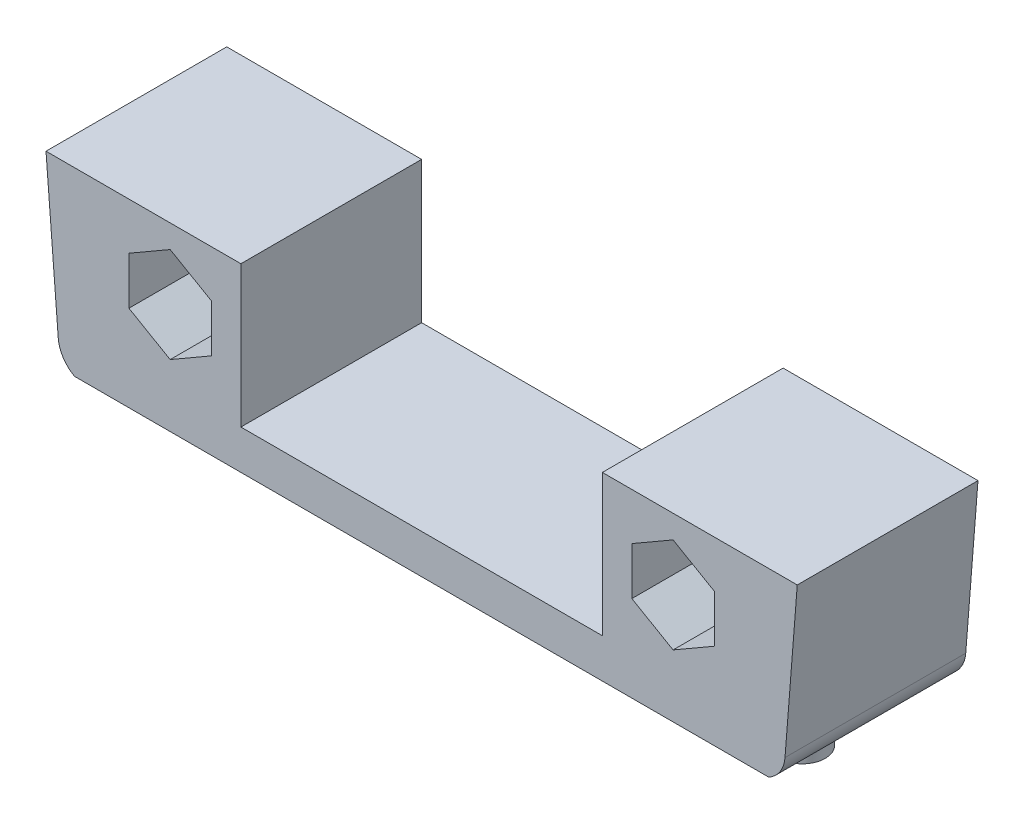
ISO-10303-21;
HEADER;
FILE_DESCRIPTION(('STEP AP214'),'2;1');
FILE_NAME('part.step','',(''),(''),'','','');
FILE_SCHEMA(('AUTOMOTIVE_DESIGN { 1 0 10303 214 1 1 1 1 }'));
ENDSEC;
DATA;
#1=APPLICATION_CONTEXT('core data for automotive mechanical design processes');
#2=APPLICATION_PROTOCOL_DEFINITION('international standard','automotive_design',2000,#1);
#3=PRODUCT_CONTEXT('',#1,'mechanical');
#4=PRODUCT('Part','Part','',(#3));
#5=PRODUCT_RELATED_PRODUCT_CATEGORY('part','',(#4));
#6=PRODUCT_DEFINITION_FORMATION('','',#4);
#7=PRODUCT_DEFINITION_CONTEXT('part definition',#1,'design');
#8=PRODUCT_DEFINITION('design','',#6,#7);
#9=PRODUCT_DEFINITION_SHAPE('','',#8);
#10=(LENGTH_UNIT() NAMED_UNIT(*) SI_UNIT(.MILLI.,.METRE.));
#11=(NAMED_UNIT(*) PLANE_ANGLE_UNIT() SI_UNIT($,.RADIAN.));
#12=(NAMED_UNIT(*) SI_UNIT($,.STERADIAN.) SOLID_ANGLE_UNIT());
#13=UNCERTAINTY_MEASURE_WITH_UNIT(LENGTH_MEASURE(1.E-05),#10,'distance_accuracy_value','');
#14=(GEOMETRIC_REPRESENTATION_CONTEXT(3) GLOBAL_UNCERTAINTY_ASSIGNED_CONTEXT((#13)) GLOBAL_UNIT_ASSIGNED_CONTEXT((#10,
#11,#12)) REPRESENTATION_CONTEXT('',''));
#15=CARTESIAN_POINT('',(0.,0.,0.));
#16=DIRECTION('',(0.,0.,1.));
#17=DIRECTION('',(1.,0.,0.));
#18=AXIS2_PLACEMENT_3D('',#15,#16,#17);
#19=CARTESIAN_POINT('',(15.7329265929826,-89.2258605561515,11.5));
#20=DIRECTION('',(-0.173648177666951,0.984807753012204,0.));
#21=DIRECTION('',(-0.984807753012205,-0.173648177666951,0.));
#22=AXIS2_PLACEMENT_3D('',#19,#20,#21);
#23=PLANE('',#22);
#24=DIRECTION('',(0.,0.,-1.));
#25=VECTOR('',#24,1.);
#26=CARTESIAN_POINT('',(7.28456272965367,-90.715535048099,2.25));
#27=LINE('',#26,#25);
#28=CARTESIAN_POINT('',(7.28456272965367,-90.715535048099,2.25));
#29=VERTEX_POINT('',#28);
#30=CARTESIAN_POINT('',(7.28456272965367,-90.715535048099,0.));
#31=VERTEX_POINT('',#30);
#32=EDGE_CURVE('E523',#29,#31,#27,.T.);
#33=ORIENTED_EDGE('',*,*,#32,.T.);
#34=DIRECTION('',(0.984807753012204,0.173648177666951,0.));
#35=VECTOR('',#34,1.);
#36=CARTESIAN_POINT('',(15.7329265929826,-89.2258605561515,0.));
#37=LINE('',#36,#35);
#38=CARTESIAN_POINT('',(21.474960733196,-88.2133850130826,0.));
#39=VERTEX_POINT('',#38);
#40=EDGE_CURVE('E251',#31,#39,#37,.T.);
#41=ORIENTED_EDGE('',*,*,#40,.T.);
#42=DIRECTION('',(0.,0.,-1.));
#43=VECTOR('',#42,1.);
#44=CARTESIAN_POINT('',(21.474960733196,-88.2133850130826,11.5));
#45=LINE('',#44,#43);
#46=CARTESIAN_POINT('',(21.474960733196,-88.2133850130826,2.25));
#47=VERTEX_POINT('',#46);
#48=EDGE_CURVE('E332',#47,#39,#45,.T.);
#49=ORIENTED_EDGE('',*,*,#48,.F.);
#50=DIRECTION('',(0.984807753012205,0.173648177666951,0.));
#51=VECTOR('',#50,1.);
#52=CARTESIAN_POINT('',(15.7329265929826,-89.2258605561515,2.25));
#53=LINE('',#52,#51);
#54=EDGE_CURVE('E399',#29,#47,#53,.T.);
#55=ORIENTED_EDGE('',*,*,#54,.F.);
#56=EDGE_LOOP('',(#33,#41,#49,#55));
#57=FACE_BOUND('',#56,.T.);
#58=ADVANCED_FACE('F34',(#57),#23,.F.);
#59=DIRECTION('',(0.,0.,1.));
#60=VECTOR('',#59,1.);
#61=CARTESIAN_POINT('',(4.28456272965367,-91.2445159902244,2.25));
#62=LINE('',#61,#60);
#63=CARTESIAN_POINT('',(4.28456272965367,-91.2445159902244,0.));
#64=VERTEX_POINT('',#63);
#65=CARTESIAN_POINT('',(4.28456272965367,-91.2445159902244,2.25));
#66=VERTEX_POINT('',#65);
#67=EDGE_CURVE('E241',#64,#66,#62,.T.);
#68=ORIENTED_EDGE('',*,*,#67,.T.);
#69=CARTESIAN_POINT('',(2.28636554133743E-12,-92.,2.25));
#70=VERTEX_POINT('',#69);
#71=EDGE_CURVE('E376',#70,#66,#53,.T.);
#72=ORIENTED_EDGE('',*,*,#71,.F.);
#73=DIRECTION('',(0.,0.,-1.));
#74=VECTOR('',#73,1.);
#75=CARTESIAN_POINT('',(2.26207941267376E-12,-92.,11.5));
#76=LINE('',#75,#74);
#77=CARTESIAN_POINT('',(2.26207941267376E-12,-92.,0.));
#78=VERTEX_POINT('',#77);
#79=EDGE_CURVE('E341',#70,#78,#76,.T.);
#80=ORIENTED_EDGE('',*,*,#79,.T.);
#81=EDGE_CURVE('E456',#78,#64,#37,.T.);
#82=ORIENTED_EDGE('',*,*,#81,.T.);
#83=EDGE_LOOP('',(#68,#72,#80,#82));
#84=FACE_BOUND('',#83,.T.);
#85=ADVANCED_FACE('F491',(#84),#23,.F.);
#86=CARTESIAN_POINT('',(0.,-85.5,11.5));
#87=DIRECTION('',(0.,-1.,0.));
#88=DIRECTION('',(0.,0.,-1.));
#89=AXIS2_PLACEMENT_3D('',#86,#87,#88);
#90=PLANE('',#89);
#91=DIRECTION('',(0.,0.,1.));
#92=VECTOR('',#91,1.);
#93=CARTESIAN_POINT('',(7.28456272965367,-85.5,2.25));
#94=LINE('',#93,#92);
#95=CARTESIAN_POINT('',(7.28456272965367,-85.5,0.));
#96=VERTEX_POINT('',#95);
#97=CARTESIAN_POINT('',(7.28456272965367,-85.5,2.25));
#98=VERTEX_POINT('',#97);
#99=EDGE_CURVE('E231',#96,#98,#94,.T.);
#100=ORIENTED_EDGE('',*,*,#99,.T.);
#101=DIRECTION('',(-1.,0.,0.));
#102=VECTOR('',#101,1.);
#103=CARTESIAN_POINT('',(7.28456272965367,-85.5,2.25));
#104=LINE('',#103,#102);
#105=CARTESIAN_POINT('',(4.28456272965367,-85.5,2.25));
#106=VERTEX_POINT('',#105);
#107=EDGE_CURVE('E252',#98,#106,#104,.T.);
#108=ORIENTED_EDGE('',*,*,#107,.T.);
#109=DIRECTION('',(0.,0.,-1.));
#110=VECTOR('',#109,1.);
#111=CARTESIAN_POINT('',(4.28456272965367,-85.5,2.25));
#112=LINE('',#111,#110);
#113=CARTESIAN_POINT('',(4.28456272965367,-85.5,0.));
#114=VERTEX_POINT('',#113);
#115=EDGE_CURVE('E242',#106,#114,#112,.T.);
#116=ORIENTED_EDGE('',*,*,#115,.T.);
#117=DIRECTION('',(-1.,0.,0.));
#118=VECTOR('',#117,1.);
#119=CARTESIAN_POINT('',(0.,-85.5,0.));
#120=LINE('',#119,#118);
#121=CARTESIAN_POINT('',(-11.5,-85.5,0.));
#122=VERTEX_POINT('',#121);
#123=EDGE_CURVE('E261',#114,#122,#120,.T.);
#124=ORIENTED_EDGE('',*,*,#123,.T.);
#125=DIRECTION('',(0.,0.,-1.));
#126=VECTOR('',#125,1.);
#127=CARTESIAN_POINT('',(-11.5,-85.5,11.5));
#128=LINE('',#127,#126);
#129=CARTESIAN_POINT('',(-11.5,-85.5,11.5));
#130=VERTEX_POINT('',#129);
#131=EDGE_CURVE('E353',#130,#122,#128,.T.);
#132=ORIENTED_EDGE('',*,*,#131,.F.);
#133=DIRECTION('',(-1.,0.,0.));
#134=VECTOR('',#133,1.);
#135=CARTESIAN_POINT('',(0.,-85.5,11.5));
#136=LINE('',#135,#134);
#137=CARTESIAN_POINT('',(11.5,-85.5,11.5));
#138=VERTEX_POINT('',#137);
#139=EDGE_CURVE('E412',#138,#130,#136,.T.);
#140=ORIENTED_EDGE('',*,*,#139,.F.);
#141=DIRECTION('',(0.,0.,-1.));
#142=VECTOR('',#141,1.);
#143=CARTESIAN_POINT('',(11.5,-85.5,11.5));
#144=LINE('',#143,#142);
#145=CARTESIAN_POINT('',(11.5,-85.5,0.));
#146=VERTEX_POINT('',#145);
#147=EDGE_CURVE('E259',#138,#146,#144,.T.);
#148=ORIENTED_EDGE('',*,*,#147,.T.);
#149=EDGE_CURVE('E249',#146,#96,#120,.T.);
#150=ORIENTED_EDGE('',*,*,#149,.T.);
#151=EDGE_LOOP('',(#100,#108,#116,#124,#132,#140,#148,#150));
#152=FACE_BOUND('',#151,.T.);
#153=ADVANCED_FACE('F256',(#152),#90,.F.);
#154=CARTESIAN_POINT('',(0.,0.,0.));
#155=DIRECTION('',(0.,0.,1.));
#156=DIRECTION('',(1.,0.,0.));
#157=AXIS2_PLACEMENT_3D('',#154,#155,#156);
#158=PLANE('',#157);
#159=DIRECTION('',(0.866025403784439,-0.5,0.));
#160=VECTOR('',#159,1.);
#161=CARTESIAN_POINT('',(-32.3865288532697,-56.0951134546586,0.));
#162=LINE('',#161,#160);
#163=CARTESIAN_POINT('',(13.3750000000001,-82.5155444566228,0.));
#164=VERTEX_POINT('',#163);
#165=CARTESIAN_POINT('',(16.,-84.0310889132455,0.));
#166=VERTEX_POINT('',#165);
#167=EDGE_CURVE('E296',#164,#166,#162,.T.);
#168=ORIENTED_EDGE('',*,*,#167,.T.);
#169=DIRECTION('',(0.86602540378444,0.499999999999999,0.));
#170=VECTOR('',#169,1.);
#171=CARTESIAN_POINT('',(40.3865288532696,-69.9515199152097,0.));
#172=LINE('',#171,#170);
#173=CARTESIAN_POINT('',(18.6249999999999,-82.5155444566227,0.));
#174=VERTEX_POINT('',#173);
#175=EDGE_CURVE('E311',#166,#174,#172,.T.);
#176=ORIENTED_EDGE('',*,*,#175,.T.);
#177=DIRECTION('',(0.,1.,0.));
#178=VECTOR('',#177,1.);
#179=CARTESIAN_POINT('',(18.6249999999999,0.,0.));
#180=LINE('',#179,#178);
#181=CARTESIAN_POINT('',(18.6249999999999,-79.4844555433773,0.));
#182=VERTEX_POINT('',#181);
#183=EDGE_CURVE('E308',#174,#182,#180,.T.);
#184=ORIENTED_EDGE('',*,*,#183,.T.);
#185=DIRECTION('',(-0.86602540378444,0.499999999999998,0.));
#186=VECTOR('',#185,1.);
#187=CARTESIAN_POINT('',(-29.7615288532698,-51.5484800847906,0.));
#188=LINE('',#187,#186);
#189=CARTESIAN_POINT('',(16.,-77.9689110867545,0.));
#190=VERTEX_POINT('',#189);
#191=EDGE_CURVE('E305',#182,#190,#188,.T.);
#192=ORIENTED_EDGE('',*,*,#191,.T.);
#193=DIRECTION('',(-0.866025403784441,-0.499999999999997,0.));
#194=VECTOR('',#193,1.);
#195=CARTESIAN_POINT('',(37.7615288532696,-65.4048865453417,0.));
#196=LINE('',#195,#194);
#197=CARTESIAN_POINT('',(13.3750000000001,-79.4844555433772,0.));
#198=VERTEX_POINT('',#197);
#199=EDGE_CURVE('E302',#190,#198,#196,.T.);
#200=ORIENTED_EDGE('',*,*,#199,.T.);
#201=DIRECTION('',(0.,-1.,0.));
#202=VECTOR('',#201,1.);
#203=CARTESIAN_POINT('',(13.3750000000001,0.,0.));
#204=LINE('',#203,#202);
#205=EDGE_CURVE('E299',#198,#164,#204,.T.);
#206=ORIENTED_EDGE('',*,*,#205,.T.);
#207=EDGE_LOOP('',(#168,#176,#184,#192,#200,#206));
#208=FACE_BOUND('',#207,.T.);
#209=DIRECTION('',(0.,-1.,0.));
#210=VECTOR('',#209,1.);
#211=CARTESIAN_POINT('',(7.28456272965367,-76.499,0.));
#212=LINE('',#211,#210);
#213=EDGE_CURVE('E234',#96,#31,#212,.T.);
#214=ORIENTED_EDGE('',*,*,#213,.F.);
#215=ORIENTED_EDGE('',*,*,#149,.F.);
#216=DIRECTION('',(0.,-1.,0.));
#217=VECTOR('',#216,1.);
#218=CARTESIAN_POINT('',(11.5,0.,0.));
#219=LINE('',#218,#217);
#220=CARTESIAN_POINT('',(11.5,-76.5,0.));
#221=VERTEX_POINT('',#220);
#222=EDGE_CURVE('E266',#221,#146,#219,.T.);
#223=ORIENTED_EDGE('',*,*,#222,.F.);
#224=DIRECTION('',(1.,0.,0.));
#225=VECTOR('',#224,1.);
#226=CARTESIAN_POINT('',(0.,-76.5,0.));
#227=LINE('',#226,#225);
#228=CARTESIAN_POINT('',(23.9007000659389,-76.5,0.));
#229=VERTEX_POINT('',#228);
#230=EDGE_CURVE('E463',#221,#229,#227,.T.);
#231=ORIENTED_EDGE('',*,*,#230,.T.);
#232=DIRECTION('',(0.0784590957278457,0.996917333733128,0.));
#233=VECTOR('',#232,1.);
#234=CARTESIAN_POINT('',(29.737189714353,-2.34036758668709,0.));
#235=LINE('',#234,#233);
#236=CARTESIAN_POINT('',(23.1214990453283,-86.4006876985139,0.));
#237=VERTEX_POINT('',#236);
#238=EDGE_CURVE('E461',#237,#229,#235,.T.);
#239=ORIENTED_EDGE('',*,*,#238,.F.);
#240=CARTESIAN_POINT('',(21.1276643778621,-86.2437695070582,0.));
#241=DIRECTION('',(0.,0.,1.));
#242=DIRECTION('',(1.,0.,0.));
#243=AXIS2_PLACEMENT_3D('',#240,#241,#242);
#244=CIRCLE('',#243,2.00000000000001);
#245=EDGE_CURVE('E459',#39,#237,#244,.T.);
#246=ORIENTED_EDGE('',*,*,#245,.F.);
#247=ORIENTED_EDGE('',*,*,#40,.F.);
#248=EDGE_LOOP('',(#214,#215,#223,#231,#239,#246,#247));
#249=FACE_BOUND('',#248,.T.);
#250=ADVANCED_FACE('F247',(#208,#249),#158,.F.);
#251=DIRECTION('',(0.866025403784439,-0.5,0.));
#252=VECTOR('',#251,1.);
#253=CARTESIAN_POINT('',(-40.3865288532698,-69.9515199152097,0.));
#254=LINE('',#253,#252);
#255=CARTESIAN_POINT('',(-18.625,-82.5155444566228,0.));
#256=VERTEX_POINT('',#255);
#257=CARTESIAN_POINT('',(-16.,-84.0310889132455,0.));
#258=VERTEX_POINT('',#257);
#259=EDGE_CURVE('E278',#256,#258,#254,.T.);
#260=ORIENTED_EDGE('',*,*,#259,.T.);
#261=DIRECTION('',(0.866025403784439,0.5,0.));
#262=VECTOR('',#261,1.);
#263=CARTESIAN_POINT('',(32.3865288532698,-56.0951134546586,0.));
#264=LINE('',#263,#262);
#265=CARTESIAN_POINT('',(-13.375,-82.5155444566228,0.));
#266=VERTEX_POINT('',#265);
#267=EDGE_CURVE('E293',#258,#266,#264,.T.);
#268=ORIENTED_EDGE('',*,*,#267,.T.);
#269=DIRECTION('',(0.,1.,0.));
#270=VECTOR('',#269,1.);
#271=CARTESIAN_POINT('',(-13.375,0.,0.));
#272=LINE('',#271,#270);
#273=CARTESIAN_POINT('',(-13.375,-79.4844555433773,0.));
#274=VERTEX_POINT('',#273);
#275=EDGE_CURVE('E290',#266,#274,#272,.T.);
#276=ORIENTED_EDGE('',*,*,#275,.T.);
#277=DIRECTION('',(-0.866025403784439,0.5,0.));
#278=VECTOR('',#277,1.);
#279=CARTESIAN_POINT('',(-37.7615288532698,-65.4048865453414,0.));
#280=LINE('',#279,#278);
#281=CARTESIAN_POINT('',(-16.,-77.9689110867545,0.));
#282=VERTEX_POINT('',#281);
#283=EDGE_CURVE('E287',#274,#282,#280,.T.);
#284=ORIENTED_EDGE('',*,*,#283,.T.);
#285=DIRECTION('',(-0.866025403784438,-0.500000000000001,0.));
#286=VECTOR('',#285,1.);
#287=CARTESIAN_POINT('',(29.7615288532698,-51.5484800847903,0.));
#288=LINE('',#287,#286);
#289=CARTESIAN_POINT('',(-18.625,-79.4844555433772,0.));
#290=VERTEX_POINT('',#289);
#291=EDGE_CURVE('E284',#282,#290,#288,.T.);
#292=ORIENTED_EDGE('',*,*,#291,.T.);
#293=DIRECTION('',(0.,-1.,0.));
#294=VECTOR('',#293,1.);
#295=CARTESIAN_POINT('',(-18.625,0.,0.));
#296=LINE('',#295,#294);
#297=EDGE_CURVE('E281',#290,#256,#296,.T.);
#298=ORIENTED_EDGE('',*,*,#297,.T.);
#299=EDGE_LOOP('',(#260,#268,#276,#284,#292,#298));
#300=FACE_BOUND('',#299,.T.);
#301=DIRECTION('',(0.,-1.,0.));
#302=VECTOR('',#301,1.);
#303=CARTESIAN_POINT('',(4.28456272965367,-76.499,0.));
#304=LINE('',#303,#302);
#305=EDGE_CURVE('E253',#114,#64,#304,.T.);
#306=ORIENTED_EDGE('',*,*,#305,.T.);
#307=ORIENTED_EDGE('',*,*,#81,.F.);
#308=DIRECTION('',(0.984807753012211,-0.173648177666916,0.));
#309=VECTOR('',#308,1.);
#310=CARTESIAN_POINT('',(-15.7329265929794,-89.2258605561519,0.));
#311=LINE('',#310,#309);
#312=CARTESIAN_POINT('',(-21.4749607331959,-88.2133850130826,0.));
#313=VERTEX_POINT('',#312);
#314=EDGE_CURVE('E275',#313,#78,#311,.T.);
#315=ORIENTED_EDGE('',*,*,#314,.F.);
#316=CARTESIAN_POINT('',(-21.1276643778621,-86.2437695070582,0.));
#317=DIRECTION('',(0.,0.,1.));
#318=DIRECTION('',(1.,0.,0.));
#319=AXIS2_PLACEMENT_3D('',#316,#317,#318);
#320=CIRCLE('',#319,2.00000000000001);
#321=CARTESIAN_POINT('',(-23.1214990453283,-86.4006876985139,0.));
#322=VERTEX_POINT('',#321);
#323=EDGE_CURVE('E272',#322,#313,#320,.T.);
#324=ORIENTED_EDGE('',*,*,#323,.F.);
#325=DIRECTION('',(0.0784590957278455,-0.996917333733128,0.));
#326=VECTOR('',#325,1.);
#327=CARTESIAN_POINT('',(-29.7371897143529,-2.34036758668708,0.));
#328=LINE('',#327,#326);
#329=CARTESIAN_POINT('',(-23.9007000659389,-76.5,0.));
#330=VERTEX_POINT('',#329);
#331=EDGE_CURVE('E270',#330,#322,#328,.T.);
#332=ORIENTED_EDGE('',*,*,#331,.F.);
#333=CARTESIAN_POINT('',(-11.5,-76.5,0.));
#334=VERTEX_POINT('',#333);
#335=EDGE_CURVE('E264',#330,#334,#227,.T.);
#336=ORIENTED_EDGE('',*,*,#335,.T.);
#337=DIRECTION('',(0.,1.,0.));
#338=VECTOR('',#337,1.);
#339=CARTESIAN_POINT('',(-11.5000000000001,0.,0.));
#340=LINE('',#339,#338);
#341=EDGE_CURVE('E260',#122,#334,#340,.T.);
#342=ORIENTED_EDGE('',*,*,#341,.F.);
#343=ORIENTED_EDGE('',*,*,#123,.F.);
#344=EDGE_LOOP('',(#306,#307,#315,#324,#332,#336,#342,#343));
#345=FACE_BOUND('',#344,.T.);
#346=ADVANCED_FACE('F473',(#300,#345),#158,.F.);
#347=CARTESIAN_POINT('',(-22.7499999999977,-88.,2.25));
#348=DIRECTION('',(0.,0.,1.));
#349=DIRECTION('',(1.,0.,0.));
#350=AXIS2_PLACEMENT_3D('',#347,#348,#349);
#351=PLANE('',#350);
#352=DIRECTION('',(-1.,0.,0.));
#353=VECTOR('',#352,1.);
#354=CARTESIAN_POINT('',(-22.7499999999977,-88.,2.25));
#355=LINE('',#354,#353);
#356=CARTESIAN_POINT('',(22.0845627296537,-88.,2.25));
#357=VERTEX_POINT('',#356);
#358=CARTESIAN_POINT('',(7.28456272965367,-88.,2.25));
#359=VERTEX_POINT('',#358);
#360=EDGE_CURVE('E388',#357,#359,#355,.T.);
#361=ORIENTED_EDGE('',*,*,#360,.T.);
#362=DIRECTION('',(0.,-1.,0.));
#363=VECTOR('',#362,1.);
#364=CARTESIAN_POINT('',(7.28456272965368,-88.,2.25));
#365=LINE('',#364,#363);
#366=EDGE_CURVE('E11',#359,#29,#365,.T.);
#367=ORIENTED_EDGE('',*,*,#366,.T.);
#368=ORIENTED_EDGE('',*,*,#54,.T.);
#369=CARTESIAN_POINT('',(21.1276643778621,-86.2437695070582,2.25));
#370=DIRECTION('',(0.,0.,1.));
#371=DIRECTION('',(1.,0.,0.));
#372=AXIS2_PLACEMENT_3D('',#369,#370,#371);
#373=CIRCLE('',#372,2.00000000000001);
#374=EDGE_CURVE('E401',#47,#357,#373,.T.);
#375=ORIENTED_EDGE('',*,*,#374,.T.);
#376=EDGE_LOOP('',(#361,#367,#368,#375));
#377=FACE_BOUND('',#376,.T.);
#378=ADVANCED_FACE('F547',(#377),#351,.T.);
#379=ORIENTED_EDGE('',*,*,#71,.T.);
#380=DIRECTION('',(0.,1.,0.));
#381=VECTOR('',#380,1.);
#382=CARTESIAN_POINT('',(4.28456272965367,-88.,2.25));
#383=LINE('',#382,#381);
#384=CARTESIAN_POINT('',(4.28456272965367,-88.,2.25));
#385=VERTEX_POINT('',#384);
#386=EDGE_CURVE('E41',#66,#385,#383,.T.);
#387=ORIENTED_EDGE('',*,*,#386,.T.);
#388=CARTESIAN_POINT('',(-22.0845627296537,-88.,2.25));
#389=VERTEX_POINT('',#388);
#390=EDGE_CURVE('E373',#385,#389,#355,.T.);
#391=ORIENTED_EDGE('',*,*,#390,.T.);
#392=CARTESIAN_POINT('',(-21.1276643778621,-86.2437695070582,2.25));
#393=DIRECTION('',(0.,0.,1.));
#394=DIRECTION('',(1.,0.,0.));
#395=AXIS2_PLACEMENT_3D('',#392,#393,#394);
#396=CIRCLE('',#395,2.00000000000001);
#397=CARTESIAN_POINT('',(-21.4749607331959,-88.2133850130826,2.25));
#398=VERTEX_POINT('',#397);
#399=EDGE_CURVE('E395',#389,#398,#396,.T.);
#400=ORIENTED_EDGE('',*,*,#399,.T.);
#401=DIRECTION('',(0.984807753012211,-0.173648177666916,0.));
#402=VECTOR('',#401,1.);
#403=CARTESIAN_POINT('',(-15.7329265929794,-89.2258605561519,2.25));
#404=LINE('',#403,#402);
#405=EDGE_CURVE('E367',#398,#70,#404,.T.);
#406=ORIENTED_EDGE('',*,*,#405,.T.);
#407=EDGE_LOOP('',(#379,#387,#391,#400,#406));
#408=FACE_BOUND('',#407,.T.);
#409=ADVANCED_FACE('F372',(#408),#351,.T.);
#410=CARTESIAN_POINT('',(0.,-88.,0.));
#411=DIRECTION('',(0.,-1.,0.));
#412=DIRECTION('',(0.,0.,-1.));
#413=AXIS2_PLACEMENT_3D('',#410,#411,#412);
#414=PLANE('',#413);
#415=CARTESIAN_POINT('',(-19.6,-88.,6.875));
#416=DIRECTION('',(0.,-1.,0.));
#417=DIRECTION('',(0.,0.,-1.));
#418=AXIS2_PLACEMENT_3D('',#415,#416,#417);
#419=CIRCLE('',#418,1.45);
#420=CARTESIAN_POINT('',(-19.6,-88.,5.425));
#421=VERTEX_POINT('',#420);
#422=EDGE_CURVE('E390',#421,#421,#419,.T.);
#423=ORIENTED_EDGE('',*,*,#422,.F.);
#424=EDGE_LOOP('',(#423));
#425=FACE_BOUND('',#424,.T.);
#426=DIRECTION('',(0.,0.,-1.));
#427=VECTOR('',#426,1.);
#428=CARTESIAN_POINT('',(22.0845627296537,-88.,11.5));
#429=LINE('',#428,#427);
#430=CARTESIAN_POINT('',(22.0845627296537,-88.,11.5));
#431=VERTEX_POINT('',#430);
#432=EDGE_CURVE('E56',#357,#431,#429,.F.);
#433=ORIENTED_EDGE('',*,*,#432,.T.);
#434=DIRECTION('',(1.,0.,0.));
#435=VECTOR('',#434,1.);
#436=CARTESIAN_POINT('',(0.,-88.,11.5));
#437=LINE('',#436,#435);
#438=CARTESIAN_POINT('',(-22.0845627296537,-88.,11.5));
#439=VERTEX_POINT('',#438);
#440=EDGE_CURVE('E328',#439,#431,#437,.T.);
#441=ORIENTED_EDGE('',*,*,#440,.F.);
#442=DIRECTION('',(0.,0.,-1.));
#443=VECTOR('',#442,1.);
#444=CARTESIAN_POINT('',(-22.0845627296537,-88.,11.5));
#445=LINE('',#444,#443);
#446=EDGE_CURVE('E384',#439,#389,#445,.T.);
#447=ORIENTED_EDGE('',*,*,#446,.T.);
#448=ORIENTED_EDGE('',*,*,#390,.F.);
#449=EDGE_CURVE('E381',#359,#385,#355,.T.);
#450=ORIENTED_EDGE('',*,*,#449,.F.);
#451=ORIENTED_EDGE('',*,*,#360,.F.);
#452=EDGE_LOOP('',(#433,#441,#447,#448,#450,#451));
#453=FACE_BOUND('',#452,.T.);
#454=CARTESIAN_POINT('',(19.6,-88.,6.87500000000001));
#455=DIRECTION('',(0.,-1.,0.));
#456=DIRECTION('',(0.,0.,1.));
#457=AXIS2_PLACEMENT_3D('',#454,#455,#456);
#458=CIRCLE('',#457,1.45);
#459=CARTESIAN_POINT('',(19.6,-88.,8.32500000000001));
#460=VERTEX_POINT('',#459);
#461=EDGE_CURVE('E530',#460,#460,#458,.T.);
#462=ORIENTED_EDGE('',*,*,#461,.F.);
#463=EDGE_LOOP('',(#462));
#464=FACE_BOUND('',#463,.T.);
#465=ADVANCED_FACE('F379',(#425,#453,#464),#414,.T.);
#466=CARTESIAN_POINT('',(21.1276643778621,-86.2437695070582,11.5));
#467=DIRECTION('',(0.,0.,-1.));
#468=DIRECTION('',(-1.,0.,0.));
#469=AXIS2_PLACEMENT_3D('',#466,#467,#468);
#470=CYLINDRICAL_SURFACE('',#469,2.00000000000001);
#471=ORIENTED_EDGE('',*,*,#374,.F.);
#472=ORIENTED_EDGE('',*,*,#48,.T.);
#473=ORIENTED_EDGE('',*,*,#245,.T.);
#474=DIRECTION('',(0.,0.,-1.));
#475=VECTOR('',#474,1.);
#476=CARTESIAN_POINT('',(23.1214990453283,-86.4006876985139,11.5));
#477=LINE('',#476,#475);
#478=CARTESIAN_POINT('',(23.1214990453283,-86.4006876985139,11.5));
#479=VERTEX_POINT('',#478);
#480=EDGE_CURVE('E361',#479,#237,#477,.T.);
#481=ORIENTED_EDGE('',*,*,#480,.F.);
#482=CARTESIAN_POINT('',(21.1276643778621,-86.2437695070582,11.5));
#483=DIRECTION('',(0.,0.,1.));
#484=DIRECTION('',(1.,0.,0.));
#485=AXIS2_PLACEMENT_3D('',#482,#483,#484);
#486=CIRCLE('',#485,2.00000000000001);
#487=EDGE_CURVE('E314',#431,#479,#486,.T.);
#488=ORIENTED_EDGE('',*,*,#487,.F.);
#489=ORIENTED_EDGE('',*,*,#432,.F.);
#490=EDGE_LOOP('',(#471,#472,#473,#481,#488,#489));
#491=FACE_BOUND('',#490,.T.);
#492=ADVANCED_FACE('F518',(#491),#470,.T.);
#493=CARTESIAN_POINT('',(-21.1276643778621,-86.2437695070582,11.5));
#494=DIRECTION('',(0.,0.,-1.));
#495=DIRECTION('',(-1.,0.,0.));
#496=AXIS2_PLACEMENT_3D('',#493,#494,#495);
#497=CYLINDRICAL_SURFACE('',#496,2.00000000000001);
#498=ORIENTED_EDGE('',*,*,#399,.F.);
#499=ORIENTED_EDGE('',*,*,#446,.F.);
#500=CARTESIAN_POINT('',(-21.1276643778621,-86.2437695070582,11.5));
#501=DIRECTION('',(0.,0.,1.));
#502=DIRECTION('',(1.,0.,0.));
#503=AXIS2_PLACEMENT_3D('',#500,#501,#502);
#504=CIRCLE('',#503,2.00000000000001);
#505=CARTESIAN_POINT('',(-23.1214990453283,-86.4006876985139,11.5));
#506=VERTEX_POINT('',#505);
#507=EDGE_CURVE('E418',#506,#439,#504,.T.);
#508=ORIENTED_EDGE('',*,*,#507,.F.);
#509=DIRECTION('',(0.,0.,-1.));
#510=VECTOR('',#509,1.);
#511=CARTESIAN_POINT('',(-23.1214990453283,-86.4006876985139,11.5));
#512=LINE('',#511,#510);
#513=EDGE_CURVE('E346',#506,#322,#512,.T.);
#514=ORIENTED_EDGE('',*,*,#513,.T.);
#515=ORIENTED_EDGE('',*,*,#323,.T.);
#516=DIRECTION('',(0.,0.,-1.));
#517=VECTOR('',#516,1.);
#518=CARTESIAN_POINT('',(-21.4749607331959,-88.2133850130826,11.5));
#519=LINE('',#518,#517);
#520=EDGE_CURVE('E343',#398,#313,#519,.T.);
#521=ORIENTED_EDGE('',*,*,#520,.F.);
#522=EDGE_LOOP('',(#498,#499,#508,#514,#515,#521));
#523=FACE_BOUND('',#522,.T.);
#524=ADVANCED_FACE('F498',(#523),#497,.T.);
#525=CARTESIAN_POINT('',(-15.7329265929794,-89.2258605561519,11.5));
#526=DIRECTION('',(0.173648177666916,0.984807753012211,0.));
#527=DIRECTION('',(-0.984807753012211,0.173648177666916,0.));
#528=AXIS2_PLACEMENT_3D('',#525,#526,#527);
#529=PLANE('',#528);
#530=ORIENTED_EDGE('',*,*,#405,.F.);
#531=ORIENTED_EDGE('',*,*,#520,.T.);
#532=ORIENTED_EDGE('',*,*,#314,.T.);
#533=ORIENTED_EDGE('',*,*,#79,.F.);
#534=EDGE_LOOP('',(#530,#531,#532,#533));
#535=FACE_BOUND('',#534,.T.);
#536=ADVANCED_FACE('F495',(#535),#529,.F.);
#537=CARTESIAN_POINT('',(0.,0.,11.5));
#538=DIRECTION('',(0.,0.,1.));
#539=DIRECTION('',(1.,0.,0.));
#540=AXIS2_PLACEMENT_3D('',#537,#538,#539);
#541=PLANE('',#540);
#542=DIRECTION('',(0.866025403784439,-0.5,0.));
#543=VECTOR('',#542,1.);
#544=CARTESIAN_POINT('',(-32.3865288532697,-56.0951134546586,11.5));
#545=LINE('',#544,#543);
#546=CARTESIAN_POINT('',(13.3750000000001,-82.5155444566228,11.5));
#547=VERTEX_POINT('',#546);
#548=CARTESIAN_POINT('',(16.,-84.0310889132455,11.5));
#549=VERTEX_POINT('',#548);
#550=EDGE_CURVE('E439',#547,#549,#545,.T.);
#551=ORIENTED_EDGE('',*,*,#550,.F.);
#552=DIRECTION('',(0.,-1.,0.));
#553=VECTOR('',#552,1.);
#554=CARTESIAN_POINT('',(13.3750000000001,0.,11.5));
#555=LINE('',#554,#553);
#556=CARTESIAN_POINT('',(13.3750000000001,-79.4844555433772,11.5));
#557=VERTEX_POINT('',#556);
#558=EDGE_CURVE('E442',#557,#547,#555,.T.);
#559=ORIENTED_EDGE('',*,*,#558,.F.);
#560=DIRECTION('',(-0.866025403784441,-0.499999999999997,0.));
#561=VECTOR('',#560,1.);
#562=CARTESIAN_POINT('',(37.7615288532696,-65.4048865453417,11.5));
#563=LINE('',#562,#561);
#564=CARTESIAN_POINT('',(16.,-77.9689110867545,11.5));
#565=VERTEX_POINT('',#564);
#566=EDGE_CURVE('E445',#565,#557,#563,.T.);
#567=ORIENTED_EDGE('',*,*,#566,.F.);
#568=DIRECTION('',(-0.86602540378444,0.499999999999998,0.));
#569=VECTOR('',#568,1.);
#570=CARTESIAN_POINT('',(-29.7615288532698,-51.5484800847906,11.5));
#571=LINE('',#570,#569);
#572=CARTESIAN_POINT('',(18.6249999999999,-79.4844555433773,11.5));
#573=VERTEX_POINT('',#572);
#574=EDGE_CURVE('E448',#573,#565,#571,.T.);
#575=ORIENTED_EDGE('',*,*,#574,.F.);
#576=DIRECTION('',(0.,1.,0.));
#577=VECTOR('',#576,1.);
#578=CARTESIAN_POINT('',(18.6249999999999,0.,11.5));
#579=LINE('',#578,#577);
#580=CARTESIAN_POINT('',(18.6249999999999,-82.5155444566227,11.5));
#581=VERTEX_POINT('',#580);
#582=EDGE_CURVE('E451',#581,#573,#579,.T.);
#583=ORIENTED_EDGE('',*,*,#582,.F.);
#584=DIRECTION('',(0.86602540378444,0.499999999999999,0.));
#585=VECTOR('',#584,1.);
#586=CARTESIAN_POINT('',(40.3865288532696,-69.9515199152097,11.5));
#587=LINE('',#586,#585);
#588=EDGE_CURVE('E344',#549,#581,#587,.T.);
#589=ORIENTED_EDGE('',*,*,#588,.F.);
#590=EDGE_LOOP('',(#551,#559,#567,#575,#583,#589));
#591=FACE_BOUND('',#590,.T.);
#592=DIRECTION('',(0.866025403784439,-0.5,0.));
#593=VECTOR('',#592,1.);
#594=CARTESIAN_POINT('',(-40.3865288532698,-69.9515199152097,11.5));
#595=LINE('',#594,#593);
#596=CARTESIAN_POINT('',(-18.625,-82.5155444566228,11.5));
#597=VERTEX_POINT('',#596);
#598=CARTESIAN_POINT('',(-16.,-84.0310889132455,11.5));
#599=VERTEX_POINT('',#598);
#600=EDGE_CURVE('E421',#597,#599,#595,.T.);
#601=ORIENTED_EDGE('',*,*,#600,.F.);
#602=DIRECTION('',(0.,-1.,0.));
#603=VECTOR('',#602,1.);
#604=CARTESIAN_POINT('',(-18.625,0.,11.5));
#605=LINE('',#604,#603);
#606=CARTESIAN_POINT('',(-18.625,-79.4844555433772,11.5));
#607=VERTEX_POINT('',#606);
#608=EDGE_CURVE('E424',#607,#597,#605,.T.);
#609=ORIENTED_EDGE('',*,*,#608,.F.);
#610=DIRECTION('',(-0.866025403784438,-0.500000000000001,0.));
#611=VECTOR('',#610,1.);
#612=CARTESIAN_POINT('',(29.7615288532698,-51.5484800847903,11.5));
#613=LINE('',#612,#611);
#614=CARTESIAN_POINT('',(-16.,-77.9689110867545,11.5));
#615=VERTEX_POINT('',#614);
#616=EDGE_CURVE('E427',#615,#607,#613,.T.);
#617=ORIENTED_EDGE('',*,*,#616,.F.);
#618=DIRECTION('',(-0.866025403784439,0.5,0.));
#619=VECTOR('',#618,1.);
#620=CARTESIAN_POINT('',(-37.7615288532698,-65.4048865453414,11.5));
#621=LINE('',#620,#619);
#622=CARTESIAN_POINT('',(-13.375,-79.4844555433773,11.5));
#623=VERTEX_POINT('',#622);
#624=EDGE_CURVE('E430',#623,#615,#621,.T.);
#625=ORIENTED_EDGE('',*,*,#624,.F.);
#626=DIRECTION('',(0.,1.,0.));
#627=VECTOR('',#626,1.);
#628=CARTESIAN_POINT('',(-13.375,0.,11.5));
#629=LINE('',#628,#627);
#630=CARTESIAN_POINT('',(-13.375,-82.5155444566228,11.5));
#631=VERTEX_POINT('',#630);
#632=EDGE_CURVE('E433',#631,#623,#629,.T.);
#633=ORIENTED_EDGE('',*,*,#632,.F.);
#634=DIRECTION('',(0.866025403784439,0.5,0.));
#635=VECTOR('',#634,1.);
#636=CARTESIAN_POINT('',(32.3865288532698,-56.0951134546586,11.5));
#637=LINE('',#636,#635);
#638=EDGE_CURVE('E436',#599,#631,#637,.T.);
#639=ORIENTED_EDGE('',*,*,#638,.F.);
#640=EDGE_LOOP('',(#601,#609,#617,#625,#633,#639));
#641=FACE_BOUND('',#640,.T.);
#642=ORIENTED_EDGE('',*,*,#507,.T.);
#643=ORIENTED_EDGE('',*,*,#440,.T.);
#644=ORIENTED_EDGE('',*,*,#487,.T.);
#645=DIRECTION('',(0.0784590957278457,0.996917333733128,0.));
#646=VECTOR('',#645,1.);
#647=CARTESIAN_POINT('',(29.737189714353,-2.34036758668709,11.5));
#648=LINE('',#647,#646);
#649=CARTESIAN_POINT('',(23.9007000659389,-76.5,11.5));
#650=VERTEX_POINT('',#649);
#651=EDGE_CURVE('E404',#479,#650,#648,.T.);
#652=ORIENTED_EDGE('',*,*,#651,.T.);
#653=DIRECTION('',(1.,0.,0.));
#654=VECTOR('',#653,1.);
#655=CARTESIAN_POINT('',(0.,-76.5,11.5));
#656=LINE('',#655,#654);
#657=CARTESIAN_POINT('',(11.5,-76.5,11.5));
#658=VERTEX_POINT('',#657);
#659=EDGE_CURVE('E406',#658,#650,#656,.T.);
#660=ORIENTED_EDGE('',*,*,#659,.F.);
#661=DIRECTION('',(0.,-1.,0.));
#662=VECTOR('',#661,1.);
#663=CARTESIAN_POINT('',(11.5,0.,11.5));
#664=LINE('',#663,#662);
#665=EDGE_CURVE('E409',#658,#138,#664,.T.);
#666=ORIENTED_EDGE('',*,*,#665,.T.);
#667=ORIENTED_EDGE('',*,*,#139,.T.);
#668=DIRECTION('',(0.,1.,0.));
#669=VECTOR('',#668,1.);
#670=CARTESIAN_POINT('',(-11.5000000000001,0.,11.5));
#671=LINE('',#670,#669);
#672=CARTESIAN_POINT('',(-11.5,-76.5,11.5));
#673=VERTEX_POINT('',#672);
#674=EDGE_CURVE('E414',#130,#673,#671,.T.);
#675=ORIENTED_EDGE('',*,*,#674,.T.);
#676=CARTESIAN_POINT('',(-23.9007000659389,-76.5,11.5));
#677=VERTEX_POINT('',#676);
#678=EDGE_CURVE('E410',#677,#673,#656,.T.);
#679=ORIENTED_EDGE('',*,*,#678,.F.);
#680=DIRECTION('',(0.0784590957278455,-0.996917333733128,0.));
#681=VECTOR('',#680,1.);
#682=CARTESIAN_POINT('',(-29.7371897143529,-2.34036758668708,11.5));
#683=LINE('',#682,#681);
#684=EDGE_CURVE('E416',#677,#506,#683,.T.);
#685=ORIENTED_EDGE('',*,*,#684,.T.);
#686=EDGE_LOOP('',(#642,#643,#644,#652,#660,#666,#667,#675,#679,#685));
#687=FACE_BOUND('',#686,.T.);
#688=ADVANCED_FACE('F504',(#591,#641,#687),#541,.T.);
#689=CARTESIAN_POINT('',(-32.3865288532697,-56.0951134546586,11.5));
#690=DIRECTION('',(0.5,0.866025403784439,0.));
#691=DIRECTION('',(-0.866025403784439,0.5,0.));
#692=AXIS2_PLACEMENT_3D('',#689,#690,#691);
#693=PLANE('',#692);
#694=ORIENTED_EDGE('',*,*,#167,.F.);
#695=DIRECTION('',(0.,0.,-1.));
#696=VECTOR('',#695,1.);
#697=CARTESIAN_POINT('',(13.3750000000001,-82.5155444566228,11.5));
#698=LINE('',#697,#696);
#699=EDGE_CURVE('E326',#547,#164,#698,.T.);
#700=ORIENTED_EDGE('',*,*,#699,.F.);
#701=ORIENTED_EDGE('',*,*,#550,.T.);
#702=DIRECTION('',(0.,0.,-1.));
#703=VECTOR('',#702,1.);
#704=CARTESIAN_POINT('',(16.,-84.0310889132455,11.5));
#705=LINE('',#704,#703);
#706=EDGE_CURVE('E315',#549,#166,#705,.T.);
#707=ORIENTED_EDGE('',*,*,#706,.T.);
#708=EDGE_LOOP('',(#694,#700,#701,#707));
#709=FACE_BOUND('',#708,.T.);
#710=ADVANCED_FACE('F692',(#709),#693,.T.);
#711=CARTESIAN_POINT('',(13.3750000000001,0.,11.5));
#712=DIRECTION('',(1.,0.,0.));
#713=DIRECTION('',(0.,0.,-1.));
#714=AXIS2_PLACEMENT_3D('',#711,#712,#713);
#715=PLANE('',#714);
#716=ORIENTED_EDGE('',*,*,#205,.F.);
#717=DIRECTION('',(0.,0.,-1.));
#718=VECTOR('',#717,1.);
#719=CARTESIAN_POINT('',(13.3750000000001,-79.4844555433772,11.5));
#720=LINE('',#719,#718);
#721=EDGE_CURVE('E324',#557,#198,#720,.T.);
#722=ORIENTED_EDGE('',*,*,#721,.F.);
#723=ORIENTED_EDGE('',*,*,#558,.T.);
#724=ORIENTED_EDGE('',*,*,#699,.T.);
#725=EDGE_LOOP('',(#716,#722,#723,#724));
#726=FACE_BOUND('',#725,.T.);
#727=ADVANCED_FACE('F682',(#726),#715,.T.);
#728=CARTESIAN_POINT('',(37.7615288532696,-65.4048865453417,11.5));
#729=DIRECTION('',(0.499999999999997,-0.866025403784441,0.));
#730=DIRECTION('',(0.866025403784441,0.499999999999997,0.));
#731=AXIS2_PLACEMENT_3D('',#728,#729,#730);
#732=PLANE('',#731);
#733=ORIENTED_EDGE('',*,*,#199,.F.);
#734=DIRECTION('',(0.,0.,-1.));
#735=VECTOR('',#734,1.);
#736=CARTESIAN_POINT('',(16.,-77.9689110867545,11.5));
#737=LINE('',#736,#735);
#738=EDGE_CURVE('E322',#565,#190,#737,.T.);
#739=ORIENTED_EDGE('',*,*,#738,.F.);
#740=ORIENTED_EDGE('',*,*,#566,.T.);
#741=ORIENTED_EDGE('',*,*,#721,.T.);
#742=EDGE_LOOP('',(#733,#739,#740,#741));
#743=FACE_BOUND('',#742,.T.);
#744=ADVANCED_FACE('F672',(#743),#732,.T.);
#745=CARTESIAN_POINT('',(-29.7615288532698,-51.5484800847906,11.5));
#746=DIRECTION('',(-0.499999999999998,-0.86602540378444,0.));
#747=DIRECTION('',(0.86602540378444,-0.499999999999998,0.));
#748=AXIS2_PLACEMENT_3D('',#745,#746,#747);
#749=PLANE('',#748);
#750=ORIENTED_EDGE('',*,*,#191,.F.);
#751=DIRECTION('',(0.,0.,-1.));
#752=VECTOR('',#751,1.);
#753=CARTESIAN_POINT('',(18.6249999999999,-79.4844555433773,11.5));
#754=LINE('',#753,#752);
#755=EDGE_CURVE('E320',#573,#182,#754,.T.);
#756=ORIENTED_EDGE('',*,*,#755,.F.);
#757=ORIENTED_EDGE('',*,*,#574,.T.);
#758=ORIENTED_EDGE('',*,*,#738,.T.);
#759=EDGE_LOOP('',(#750,#756,#757,#758));
#760=FACE_BOUND('',#759,.T.);
#761=ADVANCED_FACE('F662',(#760),#749,.T.);
#762=CARTESIAN_POINT('',(18.6249999999999,0.,11.5));
#763=DIRECTION('',(-1.,0.,0.));
#764=DIRECTION('',(0.,0.,1.));
#765=AXIS2_PLACEMENT_3D('',#762,#763,#764);
#766=PLANE('',#765);
#767=ORIENTED_EDGE('',*,*,#183,.F.);
#768=DIRECTION('',(0.,0.,-1.));
#769=VECTOR('',#768,1.);
#770=CARTESIAN_POINT('',(18.6249999999999,-82.5155444566227,11.5));
#771=LINE('',#770,#769);
#772=EDGE_CURVE('E317',#581,#174,#771,.T.);
#773=ORIENTED_EDGE('',*,*,#772,.F.);
#774=ORIENTED_EDGE('',*,*,#582,.T.);
#775=ORIENTED_EDGE('',*,*,#755,.T.);
#776=EDGE_LOOP('',(#767,#773,#774,#775));
#777=FACE_BOUND('',#776,.T.);
#778=ADVANCED_FACE('F599',(#777),#766,.T.);
#779=CARTESIAN_POINT('',(-40.3865288532698,-69.9515199152097,11.5));
#780=DIRECTION('',(0.5,0.866025403784439,0.));
#781=DIRECTION('',(-0.866025403784439,0.5,0.));
#782=AXIS2_PLACEMENT_3D('',#779,#780,#781);
#783=PLANE('',#782);
#784=ORIENTED_EDGE('',*,*,#259,.F.);
#785=DIRECTION('',(0.,0.,-1.));
#786=VECTOR('',#785,1.);
#787=CARTESIAN_POINT('',(-18.625,-82.5155444566228,11.5));
#788=LINE('',#787,#786);
#789=EDGE_CURVE('E318',#597,#256,#788,.T.);
#790=ORIENTED_EDGE('',*,*,#789,.F.);
#791=ORIENTED_EDGE('',*,*,#600,.T.);
#792=DIRECTION('',(0.,0.,-1.));
#793=VECTOR('',#792,1.);
#794=CARTESIAN_POINT('',(-16.,-84.0310889132455,11.5));
#795=LINE('',#794,#793);
#796=EDGE_CURVE('E329',#599,#258,#795,.T.);
#797=ORIENTED_EDGE('',*,*,#796,.T.);
#798=EDGE_LOOP('',(#784,#790,#791,#797));
#799=FACE_BOUND('',#798,.T.);
#800=ADVANCED_FACE('F595',(#799),#783,.T.);
#801=CARTESIAN_POINT('',(-18.625,0.,11.5));
#802=DIRECTION('',(1.,0.,0.));
#803=DIRECTION('',(0.,0.,-1.));
#804=AXIS2_PLACEMENT_3D('',#801,#802,#803);
#805=PLANE('',#804);
#806=ORIENTED_EDGE('',*,*,#297,.F.);
#807=DIRECTION('',(0.,0.,-1.));
#808=VECTOR('',#807,1.);
#809=CARTESIAN_POINT('',(-18.625,-79.4844555433772,11.5));
#810=LINE('',#809,#808);
#811=EDGE_CURVE('E338',#607,#290,#810,.T.);
#812=ORIENTED_EDGE('',*,*,#811,.F.);
#813=ORIENTED_EDGE('',*,*,#608,.T.);
#814=ORIENTED_EDGE('',*,*,#789,.T.);
#815=EDGE_LOOP('',(#806,#812,#813,#814));
#816=FACE_BOUND('',#815,.T.);
#817=ADVANCED_FACE('F591',(#816),#805,.T.);
#818=CARTESIAN_POINT('',(29.7615288532698,-51.5484800847903,11.5));
#819=DIRECTION('',(0.500000000000001,-0.866025403784438,0.));
#820=DIRECTION('',(0.866025403784438,0.500000000000001,0.));
#821=AXIS2_PLACEMENT_3D('',#818,#819,#820);
#822=PLANE('',#821);
#823=ORIENTED_EDGE('',*,*,#291,.F.);
#824=DIRECTION('',(0.,0.,-1.));
#825=VECTOR('',#824,1.);
#826=CARTESIAN_POINT('',(-16.,-77.9689110867545,11.5));
#827=LINE('',#826,#825);
#828=EDGE_CURVE('E336',#615,#282,#827,.T.);
#829=ORIENTED_EDGE('',*,*,#828,.F.);
#830=ORIENTED_EDGE('',*,*,#616,.T.);
#831=ORIENTED_EDGE('',*,*,#811,.T.);
#832=EDGE_LOOP('',(#823,#829,#830,#831));
#833=FACE_BOUND('',#832,.T.);
#834=ADVANCED_FACE('F581',(#833),#822,.T.);
#835=CARTESIAN_POINT('',(-37.7615288532698,-65.4048865453414,11.5));
#836=DIRECTION('',(-0.5,-0.866025403784439,0.));
#837=DIRECTION('',(0.866025403784439,-0.5,0.));
#838=AXIS2_PLACEMENT_3D('',#835,#836,#837);
#839=PLANE('',#838);
#840=ORIENTED_EDGE('',*,*,#283,.F.);
#841=DIRECTION('',(0.,0.,-1.));
#842=VECTOR('',#841,1.);
#843=CARTESIAN_POINT('',(-13.375,-79.4844555433773,11.5));
#844=LINE('',#843,#842);
#845=EDGE_CURVE('E334',#623,#274,#844,.T.);
#846=ORIENTED_EDGE('',*,*,#845,.F.);
#847=ORIENTED_EDGE('',*,*,#624,.T.);
#848=ORIENTED_EDGE('',*,*,#828,.T.);
#849=EDGE_LOOP('',(#840,#846,#847,#848));
#850=FACE_BOUND('',#849,.T.);
#851=ADVANCED_FACE('F575',(#850),#839,.T.);
#852=CARTESIAN_POINT('',(-13.375,0.,11.5));
#853=DIRECTION('',(-1.,0.,0.));
#854=DIRECTION('',(0.,0.,1.));
#855=AXIS2_PLACEMENT_3D('',#852,#853,#854);
#856=PLANE('',#855);
#857=ORIENTED_EDGE('',*,*,#275,.F.);
#858=DIRECTION('',(0.,0.,-1.));
#859=VECTOR('',#858,1.);
#860=CARTESIAN_POINT('',(-13.375,-82.5155444566228,11.5));
#861=LINE('',#860,#859);
#862=EDGE_CURVE('E331',#631,#266,#861,.T.);
#863=ORIENTED_EDGE('',*,*,#862,.F.);
#864=ORIENTED_EDGE('',*,*,#632,.T.);
#865=ORIENTED_EDGE('',*,*,#845,.T.);
#866=EDGE_LOOP('',(#857,#863,#864,#865));
#867=FACE_BOUND('',#866,.T.);
#868=ADVANCED_FACE('F570',(#867),#856,.T.);
#869=CARTESIAN_POINT('',(29.737189714353,-2.34036758668709,11.5));
#870=DIRECTION('',(-0.996917333733128,0.0784590957278457,0.));
#871=DIRECTION('',(-0.0784590957278457,-0.996917333733128,0.));
#872=AXIS2_PLACEMENT_3D('',#869,#870,#871);
#873=PLANE('',#872);
#874=ORIENTED_EDGE('',*,*,#238,.T.);
#875=DIRECTION('',(0.,0.,-1.));
#876=VECTOR('',#875,1.);
#877=CARTESIAN_POINT('',(23.9007000659389,-76.5,11.5));
#878=LINE('',#877,#876);
#879=EDGE_CURVE('E359',#650,#229,#878,.T.);
#880=ORIENTED_EDGE('',*,*,#879,.F.);
#881=ORIENTED_EDGE('',*,*,#651,.F.);
#882=ORIENTED_EDGE('',*,*,#480,.T.);
#883=EDGE_LOOP('',(#874,#880,#881,#882));
#884=FACE_BOUND('',#883,.T.);
#885=ADVANCED_FACE('F514',(#884),#873,.F.);
#886=CARTESIAN_POINT('',(0.,-76.5,11.5));
#887=DIRECTION('',(0.,1.,0.));
#888=DIRECTION('',(0.,0.,1.));
#889=AXIS2_PLACEMENT_3D('',#886,#887,#888);
#890=PLANE('',#889);
#891=ORIENTED_EDGE('',*,*,#230,.F.);
#892=DIRECTION('',(0.,0.,-1.));
#893=VECTOR('',#892,1.);
#894=CARTESIAN_POINT('',(11.5,-76.5,11.5));
#895=LINE('',#894,#893);
#896=EDGE_CURVE('E357',#658,#221,#895,.T.);
#897=ORIENTED_EDGE('',*,*,#896,.F.);
#898=ORIENTED_EDGE('',*,*,#659,.T.);
#899=ORIENTED_EDGE('',*,*,#879,.T.);
#900=EDGE_LOOP('',(#891,#897,#898,#899));
#901=FACE_BOUND('',#900,.T.);
#902=ADVANCED_FACE('F510',(#901),#890,.T.);
#903=CARTESIAN_POINT('',(11.5,0.,11.5));
#904=DIRECTION('',(1.,0.,0.));
#905=DIRECTION('',(0.,0.,-1.));
#906=AXIS2_PLACEMENT_3D('',#903,#904,#905);
#907=PLANE('',#906);
#908=ORIENTED_EDGE('',*,*,#222,.T.);
#909=ORIENTED_EDGE('',*,*,#147,.F.);
#910=ORIENTED_EDGE('',*,*,#665,.F.);
#911=ORIENTED_EDGE('',*,*,#896,.T.);
#912=EDGE_LOOP('',(#908,#909,#910,#911));
#913=FACE_BOUND('',#912,.T.);
#914=ADVANCED_FACE('F508',(#913),#907,.F.);
#915=CARTESIAN_POINT('',(-11.5000000000001,0.,11.5));
#916=DIRECTION('',(-1.,0.,0.));
#917=DIRECTION('',(0.,-1.,0.));
#918=AXIS2_PLACEMENT_3D('',#915,#916,#917);
#919=PLANE('',#918);
#920=ORIENTED_EDGE('',*,*,#341,.T.);
#921=DIRECTION('',(0.,0.,-1.));
#922=VECTOR('',#921,1.);
#923=CARTESIAN_POINT('',(-11.5,-76.5,11.5));
#924=LINE('',#923,#922);
#925=EDGE_CURVE('E351',#673,#334,#924,.T.);
#926=ORIENTED_EDGE('',*,*,#925,.F.);
#927=ORIENTED_EDGE('',*,*,#674,.F.);
#928=ORIENTED_EDGE('',*,*,#131,.T.);
#929=EDGE_LOOP('',(#920,#926,#927,#928));
#930=FACE_BOUND('',#929,.T.);
#931=ADVANCED_FACE('F484',(#930),#919,.F.);
#932=ORIENTED_EDGE('',*,*,#335,.F.);
#933=DIRECTION('',(0.,0.,-1.));
#934=VECTOR('',#933,1.);
#935=CARTESIAN_POINT('',(-23.9007000659389,-76.5,11.5));
#936=LINE('',#935,#934);
#937=EDGE_CURVE('E349',#677,#330,#936,.T.);
#938=ORIENTED_EDGE('',*,*,#937,.F.);
#939=ORIENTED_EDGE('',*,*,#678,.T.);
#940=ORIENTED_EDGE('',*,*,#925,.T.);
#941=EDGE_LOOP('',(#932,#938,#939,#940));
#942=FACE_BOUND('',#941,.T.);
#943=ADVANCED_FACE('F477',(#942),#890,.T.);
#944=CARTESIAN_POINT('',(-29.7371897143529,-2.34036758668708,11.5));
#945=DIRECTION('',(0.996917333733128,0.0784590957278455,0.));
#946=DIRECTION('',(-0.0784590957278455,0.996917333733128,0.));
#947=AXIS2_PLACEMENT_3D('',#944,#945,#946);
#948=PLANE('',#947);
#949=ORIENTED_EDGE('',*,*,#331,.T.);
#950=ORIENTED_EDGE('',*,*,#513,.F.);
#951=ORIENTED_EDGE('',*,*,#684,.F.);
#952=ORIENTED_EDGE('',*,*,#937,.T.);
#953=EDGE_LOOP('',(#949,#950,#951,#952));
#954=FACE_BOUND('',#953,.T.);
#955=ADVANCED_FACE('F502',(#954),#948,.F.);
#956=CARTESIAN_POINT('',(32.3865288532698,-56.0951134546586,11.5));
#957=DIRECTION('',(-0.5,0.866025403784439,0.));
#958=DIRECTION('',(-0.866025403784439,-0.5,0.));
#959=AXIS2_PLACEMENT_3D('',#956,#957,#958);
#960=PLANE('',#959);
#961=ORIENTED_EDGE('',*,*,#267,.F.);
#962=ORIENTED_EDGE('',*,*,#796,.F.);
#963=ORIENTED_EDGE('',*,*,#638,.T.);
#964=ORIENTED_EDGE('',*,*,#862,.T.);
#965=EDGE_LOOP('',(#961,#962,#963,#964));
#966=FACE_BOUND('',#965,.T.);
#967=ADVANCED_FACE('F586',(#966),#960,.T.);
#968=CARTESIAN_POINT('',(40.3865288532696,-69.9515199152097,11.5));
#969=DIRECTION('',(-0.499999999999999,0.866025403784439,0.));
#970=DIRECTION('',(-0.86602540378444,-0.499999999999999,0.));
#971=AXIS2_PLACEMENT_3D('',#968,#969,#970);
#972=PLANE('',#971);
#973=ORIENTED_EDGE('',*,*,#175,.F.);
#974=ORIENTED_EDGE('',*,*,#706,.F.);
#975=ORIENTED_EDGE('',*,*,#588,.T.);
#976=ORIENTED_EDGE('',*,*,#772,.T.);
#977=EDGE_LOOP('',(#973,#974,#975,#976));
#978=FACE_BOUND('',#977,.T.);
#979=ADVANCED_FACE('F710',(#978),#972,.T.);
#980=CARTESIAN_POINT('',(-19.6,-89.8,6.875));
#981=DIRECTION('',(0.,1.,0.));
#982=DIRECTION('',(0.,0.,1.));
#983=AXIS2_PLACEMENT_3D('',#980,#981,#982);
#984=CYLINDRICAL_SURFACE('',#983,1.45);
#985=CARTESIAN_POINT('',(-19.6,-89.8,6.875));
#986=DIRECTION('',(0.,-1.,0.));
#987=DIRECTION('',(0.,0.,-1.));
#988=AXIS2_PLACEMENT_3D('',#985,#986,#987);
#989=CIRCLE('',#988,1.45);
#990=CARTESIAN_POINT('',(-19.6,-89.8,5.425));
#991=VERTEX_POINT('',#990);
#992=EDGE_CURVE('E386',#991,#991,#989,.T.);
#993=ORIENTED_EDGE('',*,*,#992,.F.);
#994=EDGE_LOOP('',(#993));
#995=FACE_BOUND('',#994,.T.);
#996=ORIENTED_EDGE('',*,*,#422,.T.);
#997=EDGE_LOOP('',(#996));
#998=FACE_BOUND('',#997,.T.);
#999=ADVANCED_FACE('F538',(#995,#998),#984,.T.);
#1000=CARTESIAN_POINT('',(-19.6,-89.8,6.875));
#1001=DIRECTION('',(0.,-1.,0.));
#1002=DIRECTION('',(0.,0.,-1.));
#1003=AXIS2_PLACEMENT_3D('',#1000,#1001,#1002);
#1004=PLANE('',#1003);
#1005=ORIENTED_EDGE('',*,*,#992,.T.);
#1006=EDGE_LOOP('',(#1005));
#1007=FACE_BOUND('',#1006,.T.);
#1008=ADVANCED_FACE('F813',(#1007),#1004,.T.);
#1009=CARTESIAN_POINT('',(19.6,-89.8,6.87500000000001));
#1010=DIRECTION('',(0.,1.,0.));
#1011=DIRECTION('',(0.,0.,1.));
#1012=AXIS2_PLACEMENT_3D('',#1009,#1010,#1011);
#1013=CYLINDRICAL_SURFACE('',#1012,1.45);
#1014=CARTESIAN_POINT('',(19.6,-89.8,6.87500000000001));
#1015=DIRECTION('',(0.,-1.,0.));
#1016=DIRECTION('',(0.,0.,1.));
#1017=AXIS2_PLACEMENT_3D('',#1014,#1015,#1016);
#1018=CIRCLE('',#1017,1.45);
#1019=CARTESIAN_POINT('',(19.6,-89.8,8.32500000000001));
#1020=VERTEX_POINT('',#1019);
#1021=EDGE_CURVE('E531',#1020,#1020,#1018,.T.);
#1022=ORIENTED_EDGE('',*,*,#1021,.F.);
#1023=EDGE_LOOP('',(#1022));
#1024=FACE_BOUND('',#1023,.T.);
#1025=ORIENTED_EDGE('',*,*,#461,.T.);
#1026=EDGE_LOOP('',(#1025));
#1027=FACE_BOUND('',#1026,.T.);
#1028=ADVANCED_FACE('F819',(#1024,#1027),#1013,.T.);
#1029=CARTESIAN_POINT('',(19.6,-89.8,6.87500000000001));
#1030=DIRECTION('',(0.,1.,0.));
#1031=DIRECTION('',(0.,0.,1.));
#1032=AXIS2_PLACEMENT_3D('',#1029,#1030,#1031);
#1033=PLANE('',#1032);
#1034=ORIENTED_EDGE('',*,*,#1021,.T.);
#1035=EDGE_LOOP('',(#1034));
#1036=FACE_BOUND('',#1035,.T.);
#1037=ADVANCED_FACE('F827',(#1036),#1033,.F.);
#1038=CARTESIAN_POINT('',(7.28456272965367,-76.499,2.25));
#1039=DIRECTION('',(-1.,0.,0.));
#1040=DIRECTION('',(0.,0.,1.));
#1041=AXIS2_PLACEMENT_3D('',#1038,#1039,#1040);
#1042=PLANE('',#1041);
#1043=DIRECTION('',(0.,-1.,0.));
#1044=VECTOR('',#1043,1.);
#1045=CARTESIAN_POINT('',(7.28456272965367,-76.499,2.25));
#1046=LINE('',#1045,#1044);
#1047=EDGE_CURVE('E237',#98,#359,#1046,.T.);
#1048=ORIENTED_EDGE('',*,*,#1047,.F.);
#1049=ORIENTED_EDGE('',*,*,#99,.F.);
#1050=ORIENTED_EDGE('',*,*,#213,.T.);
#1051=ORIENTED_EDGE('',*,*,#32,.F.);
#1052=ORIENTED_EDGE('',*,*,#366,.F.);
#1053=EDGE_LOOP('',(#1048,#1049,#1050,#1051,#1052));
#1054=FACE_BOUND('',#1053,.T.);
#1055=ADVANCED_FACE('F233',(#1054),#1042,.T.);
#1056=CARTESIAN_POINT('',(4.28456272965367,-76.499,2.25));
#1057=DIRECTION('',(1.,0.,0.));
#1058=DIRECTION('',(0.,0.,-1.));
#1059=AXIS2_PLACEMENT_3D('',#1056,#1057,#1058);
#1060=PLANE('',#1059);
#1061=ORIENTED_EDGE('',*,*,#305,.F.);
#1062=ORIENTED_EDGE('',*,*,#115,.F.);
#1063=DIRECTION('',(0.,-1.,0.));
#1064=VECTOR('',#1063,1.);
#1065=CARTESIAN_POINT('',(4.28456272965367,-76.499,2.25));
#1066=LINE('',#1065,#1064);
#1067=EDGE_CURVE('E48',#106,#385,#1066,.T.);
#1068=ORIENTED_EDGE('',*,*,#1067,.T.);
#1069=ORIENTED_EDGE('',*,*,#386,.F.);
#1070=ORIENTED_EDGE('',*,*,#67,.F.);
#1071=EDGE_LOOP('',(#1061,#1062,#1068,#1069,#1070));
#1072=FACE_BOUND('',#1071,.T.);
#1073=ADVANCED_FACE('F839',(#1072),#1060,.T.);
#1074=CARTESIAN_POINT('',(7.28456272965367,-76.499,2.25));
#1075=DIRECTION('',(0.,0.,-1.));
#1076=DIRECTION('',(-1.,0.,0.));
#1077=AXIS2_PLACEMENT_3D('',#1074,#1075,#1076);
#1078=PLANE('',#1077);
#1079=ORIENTED_EDGE('',*,*,#1067,.F.);
#1080=ORIENTED_EDGE('',*,*,#107,.F.);
#1081=ORIENTED_EDGE('',*,*,#1047,.T.);
#1082=ORIENTED_EDGE('',*,*,#449,.T.);
#1083=EDGE_LOOP('',(#1079,#1080,#1081,#1082));
#1084=FACE_BOUND('',#1083,.T.);
#1085=ADVANCED_FACE('F845',(#1084),#1078,.T.);
#1086=CLOSED_SHELL('',(#58,#85,#153,#250,#346,#378,#409,#465,#492,#524,#536,#688,#710,#727,#744,
#761,#778,#800,#817,#834,#851,#868,#885,#902,#914,#931,#943,#955,#967,#979,#999,#1008,#1028,
#1037,#1055,#1073,#1085));
#1087=MANIFOLD_SOLID_BREP('B2',#1086);
#1088=ADVANCED_BREP_SHAPE_REPRESENTATION('',(#18,#1087),#14);
#1089=SHAPE_DEFINITION_REPRESENTATION(#9,#1088);
ENDSEC;
END-ISO-10303-21;
